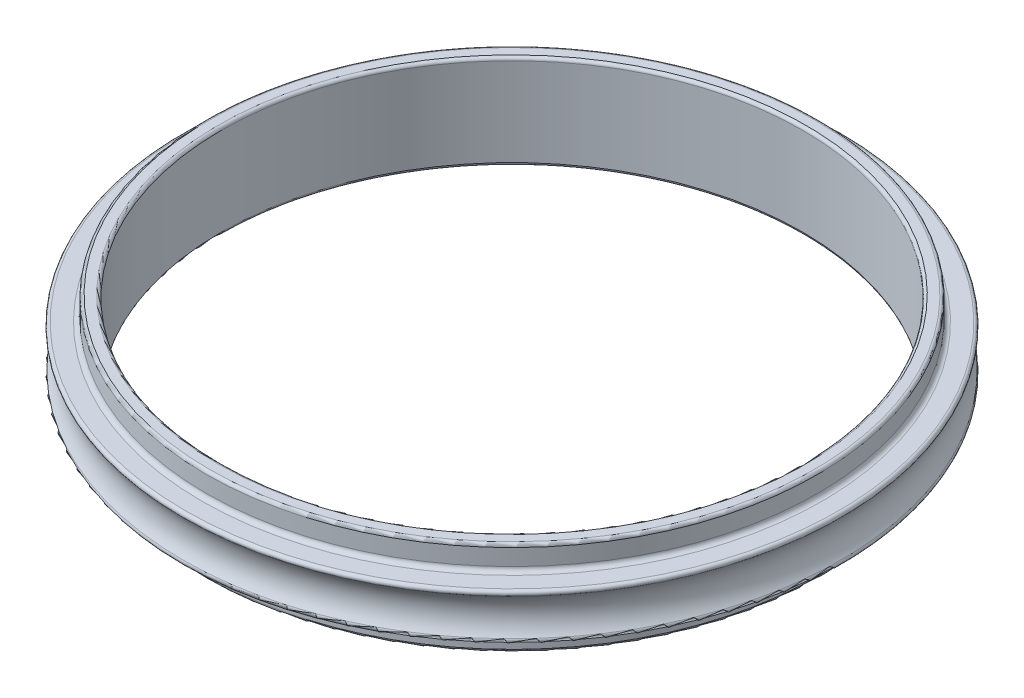
ISO-10303-21;
HEADER;
FILE_DESCRIPTION(('STEP AP214'),'2;1');
FILE_NAME('part.step','',(''),(''),'','','');
FILE_SCHEMA(('AUTOMOTIVE_DESIGN { 1 0 10303 214 1 1 1 1 }'));
ENDSEC;
DATA;
#1=APPLICATION_CONTEXT('core data for automotive mechanical design processes');
#2=APPLICATION_PROTOCOL_DEFINITION('international standard','automotive_design',2000,#1);
#3=PRODUCT_CONTEXT('',#1,'mechanical');
#4=PRODUCT('Part','Part','',(#3));
#5=PRODUCT_RELATED_PRODUCT_CATEGORY('part','',(#4));
#6=PRODUCT_DEFINITION_FORMATION('','',#4);
#7=PRODUCT_DEFINITION_CONTEXT('part definition',#1,'design');
#8=PRODUCT_DEFINITION('design','',#6,#7);
#9=PRODUCT_DEFINITION_SHAPE('','',#8);
#10=(LENGTH_UNIT() NAMED_UNIT(*) SI_UNIT(.MILLI.,.METRE.));
#11=(NAMED_UNIT(*) PLANE_ANGLE_UNIT() SI_UNIT($,.RADIAN.));
#12=(NAMED_UNIT(*) SI_UNIT($,.STERADIAN.) SOLID_ANGLE_UNIT());
#13=UNCERTAINTY_MEASURE_WITH_UNIT(LENGTH_MEASURE(1.E-05),#10,'distance_accuracy_value','');
#14=(GEOMETRIC_REPRESENTATION_CONTEXT(3) GLOBAL_UNCERTAINTY_ASSIGNED_CONTEXT((#13)) GLOBAL_UNIT_ASSIGNED_CONTEXT((#10,
#11,#12)) REPRESENTATION_CONTEXT('',''));
#15=CARTESIAN_POINT('',(0.,0.,0.));
#16=DIRECTION('',(0.,0.,1.));
#17=DIRECTION('',(1.,0.,0.));
#18=AXIS2_PLACEMENT_3D('',#15,#16,#17);
#19=CARTESIAN_POINT('',(0.,-3.7465,0.));
#20=DIRECTION('',(0.,1.,0.));
#21=DIRECTION('',(0.,0.,1.));
#22=AXIS2_PLACEMENT_3D('',#19,#20,#21);
#23=TOROIDAL_SURFACE('',#22,25.7175,0.254);
#24=CARTESIAN_POINT('',(0.,-4.0005,0.));
#25=DIRECTION('',(0.,-1.,0.));
#26=DIRECTION('',(0.,0.,1.));
#27=AXIS2_PLACEMENT_3D('',#24,#25,#26);
#28=CIRCLE('',#27,25.7175);
#29=CARTESIAN_POINT('',(0.,-4.0005,25.7175));
#30=VERTEX_POINT('',#29);
#31=EDGE_CURVE('E107',#30,#30,#28,.T.);
#32=ORIENTED_EDGE('',*,*,#31,.F.);
#33=EDGE_LOOP('',(#32));
#34=FACE_BOUND('',#33,.T.);
#35=CARTESIAN_POINT('',(0.,-3.7465,0.));
#36=DIRECTION('',(0.,1.,0.));
#37=DIRECTION('',(0.,0.,1.));
#38=AXIS2_PLACEMENT_3D('',#35,#36,#37);
#39=CIRCLE('',#38,25.9715);
#40=CARTESIAN_POINT('',(0.,-3.7465,25.9715));
#41=VERTEX_POINT('',#40);
#42=EDGE_CURVE('E28',#41,#41,#39,.T.);
#43=ORIENTED_EDGE('',*,*,#42,.F.);
#44=EDGE_LOOP('',(#43));
#45=FACE_BOUND('',#44,.T.);
#46=ADVANCED_FACE('F17',(#34,#45),#23,.T.);
#47=CARTESIAN_POINT('',(0.,3.7465,0.));
#48=DIRECTION('',(0.,1.,0.));
#49=DIRECTION('',(0.,0.,1.));
#50=AXIS2_PLACEMENT_3D('',#47,#48,#49);
#51=TOROIDAL_SURFACE('',#50,25.7175,0.254);
#52=CARTESIAN_POINT('',(0.,3.7465,0.));
#53=DIRECTION('',(0.,-1.,0.));
#54=DIRECTION('',(0.,0.,1.));
#55=AXIS2_PLACEMENT_3D('',#52,#53,#54);
#56=CIRCLE('',#55,25.9715);
#57=CARTESIAN_POINT('',(0.,3.7465,25.9715));
#58=VERTEX_POINT('',#57);
#59=EDGE_CURVE('E11',#58,#58,#56,.T.);
#60=ORIENTED_EDGE('',*,*,#59,.F.);
#61=EDGE_LOOP('',(#60));
#62=FACE_BOUND('',#61,.T.);
#63=CARTESIAN_POINT('',(0.,4.0005,0.));
#64=DIRECTION('',(0.,1.,0.));
#65=DIRECTION('',(0.,0.,1.));
#66=AXIS2_PLACEMENT_3D('',#63,#64,#65);
#67=CIRCLE('',#66,25.7175);
#68=CARTESIAN_POINT('',(0.,4.0005,25.7175));
#69=VERTEX_POINT('',#68);
#70=EDGE_CURVE('E129',#69,#69,#67,.T.);
#71=ORIENTED_EDGE('',*,*,#70,.F.);
#72=EDGE_LOOP('',(#71));
#73=FACE_BOUND('',#72,.T.);
#74=ADVANCED_FACE('F184',(#62,#73),#51,.T.);
#75=CARTESIAN_POINT('',(0.,-3.7465,0.));
#76=DIRECTION('',(0.,1.,0.));
#77=DIRECTION('',(0.,0.,1.));
#78=AXIS2_PLACEMENT_3D('',#75,#76,#77);
#79=TOROIDAL_SURFACE('',#78,24.9555,0.254);
#80=CARTESIAN_POINT('',(0.,-3.7465,0.));
#81=DIRECTION('',(0.,-1.,0.));
#82=DIRECTION('',(0.,0.,1.));
#83=AXIS2_PLACEMENT_3D('',#80,#81,#82);
#84=CIRCLE('',#83,24.7015);
#85=CARTESIAN_POINT('',(0.,-3.7465,24.7015));
#86=VERTEX_POINT('',#85);
#87=EDGE_CURVE('E97',#86,#86,#84,.T.);
#88=ORIENTED_EDGE('',*,*,#87,.F.);
#89=EDGE_LOOP('',(#88));
#90=FACE_BOUND('',#89,.T.);
#91=CARTESIAN_POINT('',(0.,-4.0005,0.));
#92=DIRECTION('',(0.,1.,0.));
#93=DIRECTION('',(0.,0.,1.));
#94=AXIS2_PLACEMENT_3D('',#91,#92,#93);
#95=CIRCLE('',#94,24.9555);
#96=CARTESIAN_POINT('',(0.,-4.0005,24.9555));
#97=VERTEX_POINT('',#96);
#98=EDGE_CURVE('E91',#97,#97,#95,.T.);
#99=ORIENTED_EDGE('',*,*,#98,.F.);
#100=EDGE_LOOP('',(#99));
#101=FACE_BOUND('',#100,.T.);
#102=ADVANCED_FACE('F150',(#90,#101),#79,.T.);
#103=CARTESIAN_POINT('',(0.,1.7145,0.));
#104=DIRECTION('',(0.,-1.,0.));
#105=DIRECTION('',(0.,0.,-1.));
#106=AXIS2_PLACEMENT_3D('',#103,#104,#105);
#107=TOROIDAL_SURFACE('',#106,27.7531889987129,0.254);
#108=CARTESIAN_POINT('',(0.,1.9685,0.));
#109=DIRECTION('',(0.,1.,0.));
#110=DIRECTION('',(0.,0.,1.));
#111=AXIS2_PLACEMENT_3D('',#108,#109,#110);
#112=CIRCLE('',#111,27.7531889987129);
#113=CARTESIAN_POINT('',(0.,1.9685,27.7531889987129));
#114=VERTEX_POINT('',#113);
#115=EDGE_CURVE('E116',#114,#114,#112,.T.);
#116=ORIENTED_EDGE('',*,*,#115,.F.);
#117=EDGE_LOOP('',(#116));
#118=FACE_BOUND('',#117,.T.);
#119=CARTESIAN_POINT('',(0.,1.55863636363634,0.));
#120=DIRECTION('',(0.,-1.,0.));
#121=DIRECTION('',(0.,0.,-1.));
#122=AXIS2_PLACEMENT_3D('',#119,#120,#121);
#123=CIRCLE('',#122,27.9537445442845);
#124=CARTESIAN_POINT('',(0.,1.55863636363634,-27.9537445442845));
#125=VERTEX_POINT('',#124);
#126=EDGE_CURVE('E113',#125,#125,#123,.T.);
#127=ORIENTED_EDGE('',*,*,#126,.F.);
#128=EDGE_LOOP('',(#127));
#129=FACE_BOUND('',#128,.T.);
#130=ADVANCED_FACE('F146',(#118,#129),#107,.T.);
#131=CARTESIAN_POINT('',(0.,1.9685,0.));
#132=DIRECTION('',(0.,-1.,0.));
#133=DIRECTION('',(0.,0.,1.));
#134=AXIS2_PLACEMENT_3D('',#131,#132,#133);
#135=CYLINDRICAL_SURFACE('',#134,25.9715);
#136=ORIENTED_EDGE('',*,*,#59,.T.);
#137=EDGE_LOOP('',(#136));
#138=FACE_BOUND('',#137,.T.);
#139=CARTESIAN_POINT('',(0.,2.3495,0.));
#140=DIRECTION('',(0.,1.,0.));
#141=DIRECTION('',(0.,0.,1.));
#142=AXIS2_PLACEMENT_3D('',#139,#140,#141);
#143=CIRCLE('',#142,25.9715);
#144=CARTESIAN_POINT('',(0.,2.3495,25.9715));
#145=VERTEX_POINT('',#144);
#146=EDGE_CURVE('E110',#145,#145,#143,.T.);
#147=ORIENTED_EDGE('',*,*,#146,.T.);
#148=EDGE_LOOP('',(#147));
#149=FACE_BOUND('',#148,.T.);
#150=ADVANCED_FACE('F149',(#138,#149),#135,.T.);
#151=CARTESIAN_POINT('',(0.,-1.9685,0.));
#152=DIRECTION('',(0.,1.,0.));
#153=DIRECTION('',(0.,0.,-1.));
#154=AXIS2_PLACEMENT_3D('',#151,#152,#153);
#155=CYLINDRICAL_SURFACE('',#154,25.9715);
#156=ORIENTED_EDGE('',*,*,#42,.T.);
#157=EDGE_LOOP('',(#156));
#158=FACE_BOUND('',#157,.T.);
#159=CARTESIAN_POINT('',(0.,-2.3495,0.));
#160=DIRECTION('',(0.,-1.,0.));
#161=DIRECTION('',(0.,0.,1.));
#162=AXIS2_PLACEMENT_3D('',#159,#160,#161);
#163=CIRCLE('',#162,25.9715);
#164=CARTESIAN_POINT('',(0.,-2.3495,25.9715));
#165=VERTEX_POINT('',#164);
#166=EDGE_CURVE('E21',#165,#165,#163,.T.);
#167=ORIENTED_EDGE('',*,*,#166,.T.);
#168=EDGE_LOOP('',(#167));
#169=FACE_BOUND('',#168,.T.);
#170=ADVANCED_FACE('F198',(#158,#169),#155,.T.);
#171=CARTESIAN_POINT('',(0.,-85.1145889546557,0.));
#172=DIRECTION('',(0.,-1.,0.));
#173=DIRECTION('',(0.,0.,1.));
#174=AXIS2_PLACEMENT_3D('',#171,#172,#173);
#175=CYLINDRICAL_SURFACE('',#174,24.7015);
#176=CARTESIAN_POINT('',(0.,3.7465,0.));
#177=DIRECTION('',(0.,1.,0.));
#178=DIRECTION('',(0.,0.,1.));
#179=AXIS2_PLACEMENT_3D('',#176,#177,#178);
#180=CIRCLE('',#179,24.7015);
#181=CARTESIAN_POINT('',(0.,3.7465,24.7015));
#182=VERTEX_POINT('',#181);
#183=EDGE_CURVE('E123',#182,#182,#180,.T.);
#184=ORIENTED_EDGE('',*,*,#183,.T.);
#185=EDGE_LOOP('',(#184));
#186=FACE_BOUND('',#185,.T.);
#187=ORIENTED_EDGE('',*,*,#87,.T.);
#188=EDGE_LOOP('',(#187));
#189=FACE_BOUND('',#188,.T.);
#190=ADVANCED_FACE('F98',(#186,#189),#175,.F.);
#191=CARTESIAN_POINT('',(0.,-4.0005,0.));
#192=DIRECTION('',(0.,1.,0.));
#193=DIRECTION('',(1.,0.,0.));
#194=AXIS2_PLACEMENT_3D('',#191,#192,#193);
#195=PLANE('',#194);
#196=ORIENTED_EDGE('',*,*,#98,.T.);
#197=EDGE_LOOP('',(#196));
#198=FACE_BOUND('',#197,.T.);
#199=ORIENTED_EDGE('',*,*,#31,.T.);
#200=EDGE_LOOP('',(#199));
#201=FACE_BOUND('',#200,.T.);
#202=ADVANCED_FACE('F197',(#198,#201),#195,.F.);
#203=CARTESIAN_POINT('',(0.,1.9685,0.));
#204=DIRECTION('',(0.,1.,0.));
#205=DIRECTION('',(1.,0.,0.));
#206=AXIS2_PLACEMENT_3D('',#203,#204,#205);
#207=PLANE('',#206);
#208=CARTESIAN_POINT('',(0.,1.9685,0.));
#209=DIRECTION('',(0.,-1.,0.));
#210=DIRECTION('',(0.,0.,1.));
#211=AXIS2_PLACEMENT_3D('',#208,#209,#210);
#212=CIRCLE('',#211,26.3525);
#213=CARTESIAN_POINT('',(0.,1.9685,26.3525));
#214=VERTEX_POINT('',#213);
#215=EDGE_CURVE('E112',#214,#214,#212,.T.);
#216=ORIENTED_EDGE('',*,*,#215,.T.);
#217=EDGE_LOOP('',(#216));
#218=FACE_BOUND('',#217,.T.);
#219=ORIENTED_EDGE('',*,*,#115,.T.);
#220=EDGE_LOOP('',(#219));
#221=FACE_BOUND('',#220,.T.);
#222=ADVANCED_FACE('F144',(#218,#221),#207,.T.);
#223=CARTESIAN_POINT('',(0.,-1.7145,0.));
#224=DIRECTION('',(0.,-1.,0.));
#225=DIRECTION('',(0.,0.,-1.));
#226=AXIS2_PLACEMENT_3D('',#223,#224,#225);
#227=TOROIDAL_SURFACE('',#226,27.7531889987129,0.254);
#228=CARTESIAN_POINT('',(0.,-1.55863636363636,0.));
#229=DIRECTION('',(0.,1.,0.));
#230=DIRECTION('',(0.,0.,1.));
#231=AXIS2_PLACEMENT_3D('',#228,#229,#230);
#232=CIRCLE('',#231,27.9537445442845);
#233=CARTESIAN_POINT('',(0.,-1.55863636363636,27.9537445442845));
#234=VERTEX_POINT('',#233);
#235=EDGE_CURVE('E117',#234,#234,#232,.T.);
#236=ORIENTED_EDGE('',*,*,#235,.F.);
#237=EDGE_LOOP('',(#236));
#238=FACE_BOUND('',#237,.T.);
#239=CARTESIAN_POINT('',(0.,-1.9685,0.));
#240=DIRECTION('',(0.,-1.,0.));
#241=DIRECTION('',(0.,0.,1.));
#242=AXIS2_PLACEMENT_3D('',#239,#240,#241);
#243=CIRCLE('',#242,27.7531889987129);
#244=CARTESIAN_POINT('',(0.,-1.9685,27.7531889987129));
#245=VERTEX_POINT('',#244);
#246=EDGE_CURVE('E118',#245,#245,#243,.T.);
#247=ORIENTED_EDGE('',*,*,#246,.F.);
#248=EDGE_LOOP('',(#247));
#249=FACE_BOUND('',#248,.T.);
#250=ADVANCED_FACE('F157',(#238,#249),#227,.T.);
#251=CARTESIAN_POINT('',(0.,0.,0.));
#252=DIRECTION('',(0.,1.,0.));
#253=DIRECTION('',(-1.,0.,0.));
#254=AXIS2_PLACEMENT_3D('',#251,#252,#253);
#255=TOROIDAL_SURFACE('',#254,29.9593,2.54);
#256=ORIENTED_EDGE('',*,*,#126,.T.);
#257=EDGE_LOOP('',(#256));
#258=FACE_BOUND('',#257,.T.);
#259=ORIENTED_EDGE('',*,*,#235,.T.);
#260=EDGE_LOOP('',(#259));
#261=FACE_BOUND('',#260,.T.);
#262=ADVANCED_FACE('F153',(#258,#261),#255,.F.);
#263=CARTESIAN_POINT('',(0.,2.3495,0.));
#264=DIRECTION('',(0.,1.,0.));
#265=DIRECTION('',(0.,0.,1.));
#266=AXIS2_PLACEMENT_3D('',#263,#264,#265);
#267=TOROIDAL_SURFACE('',#266,26.3525,0.381);
#268=ORIENTED_EDGE('',*,*,#215,.F.);
#269=EDGE_LOOP('',(#268));
#270=FACE_BOUND('',#269,.T.);
#271=ORIENTED_EDGE('',*,*,#146,.F.);
#272=EDGE_LOOP('',(#271));
#273=FACE_BOUND('',#272,.T.);
#274=ADVANCED_FACE('F156',(#270,#273),#267,.F.);
#275=CARTESIAN_POINT('',(0.,-2.3495,0.));
#276=DIRECTION('',(0.,1.,0.));
#277=DIRECTION('',(0.,0.,1.));
#278=AXIS2_PLACEMENT_3D('',#275,#276,#277);
#279=TOROIDAL_SURFACE('',#278,26.3525,0.381);
#280=ORIENTED_EDGE('',*,*,#166,.F.);
#281=EDGE_LOOP('',(#280));
#282=FACE_BOUND('',#281,.T.);
#283=CARTESIAN_POINT('',(0.,-1.9685,0.));
#284=DIRECTION('',(0.,1.,0.));
#285=DIRECTION('',(0.,0.,1.));
#286=AXIS2_PLACEMENT_3D('',#283,#284,#285);
#287=CIRCLE('',#286,26.3525);
#288=CARTESIAN_POINT('',(0.,-1.9685,26.3525));
#289=VERTEX_POINT('',#288);
#290=EDGE_CURVE('E122',#289,#289,#287,.T.);
#291=ORIENTED_EDGE('',*,*,#290,.F.);
#292=EDGE_LOOP('',(#291));
#293=FACE_BOUND('',#292,.T.);
#294=ADVANCED_FACE('F19',(#282,#293),#279,.F.);
#295=CARTESIAN_POINT('',(0.,-1.9685,0.));
#296=DIRECTION('',(0.,1.,0.));
#297=DIRECTION('',(1.,0.,0.));
#298=AXIS2_PLACEMENT_3D('',#295,#296,#297);
#299=PLANE('',#298);
#300=ORIENTED_EDGE('',*,*,#290,.T.);
#301=EDGE_LOOP('',(#300));
#302=FACE_BOUND('',#301,.T.);
#303=ORIENTED_EDGE('',*,*,#246,.T.);
#304=EDGE_LOOP('',(#303));
#305=FACE_BOUND('',#304,.T.);
#306=ADVANCED_FACE('F166',(#302,#305),#299,.F.);
#307=CARTESIAN_POINT('',(0.,3.7465,0.));
#308=DIRECTION('',(0.,1.,0.));
#309=DIRECTION('',(0.,0.,1.));
#310=AXIS2_PLACEMENT_3D('',#307,#308,#309);
#311=TOROIDAL_SURFACE('',#310,24.9555,0.254);
#312=ORIENTED_EDGE('',*,*,#183,.F.);
#313=EDGE_LOOP('',(#312));
#314=FACE_BOUND('',#313,.T.);
#315=CARTESIAN_POINT('',(0.,4.0005,0.));
#316=DIRECTION('',(0.,-1.,0.));
#317=DIRECTION('',(0.,0.,1.));
#318=AXIS2_PLACEMENT_3D('',#315,#316,#317);
#319=CIRCLE('',#318,24.9555);
#320=CARTESIAN_POINT('',(0.,4.0005,24.9555));
#321=VERTEX_POINT('',#320);
#322=EDGE_CURVE('E126',#321,#321,#319,.T.);
#323=ORIENTED_EDGE('',*,*,#322,.F.);
#324=EDGE_LOOP('',(#323));
#325=FACE_BOUND('',#324,.T.);
#326=ADVANCED_FACE('F168',(#314,#325),#311,.T.);
#327=CARTESIAN_POINT('',(0.,4.0005,0.));
#328=DIRECTION('',(0.,1.,0.));
#329=DIRECTION('',(1.,0.,0.));
#330=AXIS2_PLACEMENT_3D('',#327,#328,#329);
#331=PLANE('',#330);
#332=ORIENTED_EDGE('',*,*,#322,.T.);
#333=EDGE_LOOP('',(#332));
#334=FACE_BOUND('',#333,.T.);
#335=ORIENTED_EDGE('',*,*,#70,.T.);
#336=EDGE_LOOP('',(#335));
#337=FACE_BOUND('',#336,.T.);
#338=ADVANCED_FACE('F177',(#334,#337),#331,.T.);
#339=CLOSED_SHELL('',(#46,#74,#102,#130,#150,#170,#190,#202,#222,#250,#262,#274,#294,#306,#326,#338));
#340=MANIFOLD_SOLID_BREP('B1',#339);
#341=ADVANCED_BREP_SHAPE_REPRESENTATION('',(#18,#340),#14);
#342=SHAPE_DEFINITION_REPRESENTATION(#9,#341);
ENDSEC;
END-ISO-10303-21;
